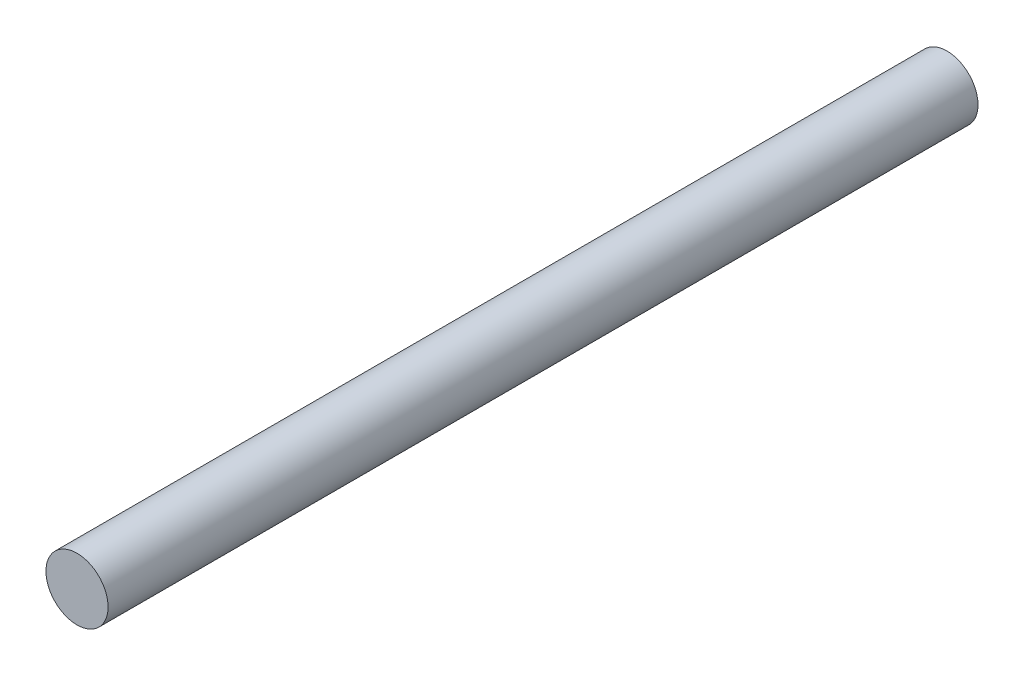
ISO-10303-21;
HEADER;
FILE_DESCRIPTION(('STEP AP214'),'2;1');
FILE_NAME('part.step','',(''),(''),'','','');
FILE_SCHEMA(('AUTOMOTIVE_DESIGN { 1 0 10303 214 1 1 1 1 }'));
ENDSEC;
DATA;
#1=APPLICATION_CONTEXT('core data for automotive mechanical design processes');
#2=APPLICATION_PROTOCOL_DEFINITION('international standard','automotive_design',2000,#1);
#3=PRODUCT_CONTEXT('',#1,'mechanical');
#4=PRODUCT('Part','Part','',(#3));
#5=PRODUCT_RELATED_PRODUCT_CATEGORY('part','',(#4));
#6=PRODUCT_DEFINITION_FORMATION('','',#4);
#7=PRODUCT_DEFINITION_CONTEXT('part definition',#1,'design');
#8=PRODUCT_DEFINITION('design','',#6,#7);
#9=PRODUCT_DEFINITION_SHAPE('','',#8);
#10=(LENGTH_UNIT() NAMED_UNIT(*) SI_UNIT(.MILLI.,.METRE.));
#11=(NAMED_UNIT(*) PLANE_ANGLE_UNIT() SI_UNIT($,.RADIAN.));
#12=(NAMED_UNIT(*) SI_UNIT($,.STERADIAN.) SOLID_ANGLE_UNIT());
#13=UNCERTAINTY_MEASURE_WITH_UNIT(LENGTH_MEASURE(1.E-05),#10,'distance_accuracy_value','');
#14=(GEOMETRIC_REPRESENTATION_CONTEXT(3) GLOBAL_UNCERTAINTY_ASSIGNED_CONTEXT((#13)) GLOBAL_UNIT_ASSIGNED_CONTEXT((#10,
#11,#12)) REPRESENTATION_CONTEXT('',''));
#15=CARTESIAN_POINT('',(0.,0.,0.));
#16=DIRECTION('',(0.,0.,1.));
#17=DIRECTION('',(1.,0.,0.));
#18=AXIS2_PLACEMENT_3D('',#15,#16,#17);
#19=CARTESIAN_POINT('',(0.,0.,-44.45));
#20=DIRECTION('',(0.,0.,1.));
#21=DIRECTION('',(1.,0.,0.));
#22=AXIS2_PLACEMENT_3D('',#19,#20,#21);
#23=CYLINDRICAL_SURFACE('',#22,1.5875);
#24=CARTESIAN_POINT('',(0.,0.,-44.45));
#25=DIRECTION('',(0.,0.,1.));
#26=DIRECTION('',(1.,0.,0.));
#27=AXIS2_PLACEMENT_3D('',#24,#25,#26);
#28=CIRCLE('',#27,1.5875);
#29=CARTESIAN_POINT('',(1.5875,0.,-44.45));
#30=VERTEX_POINT('',#29);
#31=EDGE_CURVE('E10',#30,#30,#28,.T.);
#32=ORIENTED_EDGE('',*,*,#31,.T.);
#33=EDGE_LOOP('',(#32));
#34=FACE_BOUND('',#33,.T.);
#35=CARTESIAN_POINT('',(0.,0.,0.));
#36=DIRECTION('',(0.,0.,1.));
#37=DIRECTION('',(1.,0.,0.));
#38=AXIS2_PLACEMENT_3D('',#35,#36,#37);
#39=CIRCLE('',#38,1.5875);
#40=CARTESIAN_POINT('',(1.5875,0.,0.));
#41=VERTEX_POINT('',#40);
#42=EDGE_CURVE('E34',#41,#41,#39,.T.);
#43=ORIENTED_EDGE('',*,*,#42,.F.);
#44=EDGE_LOOP('',(#43));
#45=FACE_BOUND('',#44,.T.);
#46=ADVANCED_FACE('F31',(#34,#45),#23,.T.);
#47=CARTESIAN_POINT('',(0.,0.,-44.45));
#48=DIRECTION('',(0.,0.,1.));
#49=DIRECTION('',(1.,0.,0.));
#50=AXIS2_PLACEMENT_3D('',#47,#48,#49);
#51=PLANE('',#50);
#52=ORIENTED_EDGE('',*,*,#31,.F.);
#53=EDGE_LOOP('',(#52));
#54=FACE_BOUND('',#53,.T.);
#55=ADVANCED_FACE('F46',(#54),#51,.F.);
#56=CARTESIAN_POINT('',(0.,0.,0.));
#57=DIRECTION('',(0.,0.,1.));
#58=DIRECTION('',(1.,0.,0.));
#59=AXIS2_PLACEMENT_3D('',#56,#57,#58);
#60=PLANE('',#59);
#61=ORIENTED_EDGE('',*,*,#42,.T.);
#62=EDGE_LOOP('',(#61));
#63=FACE_BOUND('',#62,.T.);
#64=ADVANCED_FACE('F43',(#63),#60,.T.);
#65=CLOSED_SHELL('',(#46,#55,#64));
#66=MANIFOLD_SOLID_BREP('B2',#65);
#67=ADVANCED_BREP_SHAPE_REPRESENTATION('',(#18,#66),#14);
#68=SHAPE_DEFINITION_REPRESENTATION(#9,#67);
ENDSEC;
END-ISO-10303-21;
